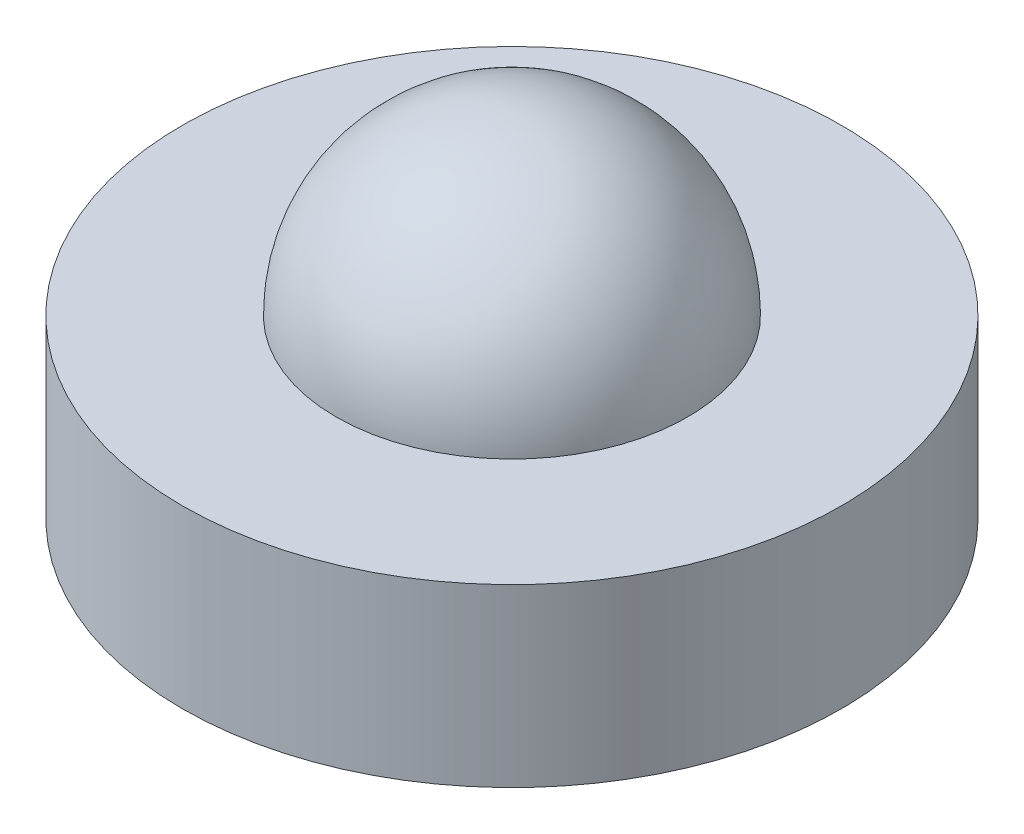
ISO-10303-21;
HEADER;
FILE_DESCRIPTION(('STEP AP214'),'2;1');
FILE_NAME('part.step','',(''),(''),'','','');
FILE_SCHEMA(('AUTOMOTIVE_DESIGN { 1 0 10303 214 1 1 1 1 }'));
ENDSEC;
DATA;
#1=APPLICATION_CONTEXT('core data for automotive mechanical design processes');
#2=APPLICATION_PROTOCOL_DEFINITION('international standard','automotive_design',2000,#1);
#3=PRODUCT_CONTEXT('',#1,'mechanical');
#4=PRODUCT('Part','Part','',(#3));
#5=PRODUCT_RELATED_PRODUCT_CATEGORY('part','',(#4));
#6=PRODUCT_DEFINITION_FORMATION('','',#4);
#7=PRODUCT_DEFINITION_CONTEXT('part definition',#1,'design');
#8=PRODUCT_DEFINITION('design','',#6,#7);
#9=PRODUCT_DEFINITION_SHAPE('','',#8);
#10=(LENGTH_UNIT() NAMED_UNIT(*) SI_UNIT(.MILLI.,.METRE.));
#11=(NAMED_UNIT(*) PLANE_ANGLE_UNIT() SI_UNIT($,.RADIAN.));
#12=(NAMED_UNIT(*) SI_UNIT($,.STERADIAN.) SOLID_ANGLE_UNIT());
#13=UNCERTAINTY_MEASURE_WITH_UNIT(LENGTH_MEASURE(1.E-05),#10,'distance_accuracy_value','');
#14=(GEOMETRIC_REPRESENTATION_CONTEXT(3) GLOBAL_UNCERTAINTY_ASSIGNED_CONTEXT((#13)) GLOBAL_UNIT_ASSIGNED_CONTEXT((#10,
#11,#12)) REPRESENTATION_CONTEXT('',''));
#15=CARTESIAN_POINT('',(0.,0.,0.));
#16=DIRECTION('',(0.,0.,1.));
#17=DIRECTION('',(1.,0.,0.));
#18=AXIS2_PLACEMENT_3D('',#15,#16,#17);
#19=CARTESIAN_POINT('',(0.,2.,0.));
#20=DIRECTION('',(-1.,0.,0.));
#21=DIRECTION('',(0.,0.,-1.));
#22=AXIS2_PLACEMENT_3D('',#19,#20,#21);
#23=SPHERICAL_SURFACE('',#22,2.);
#24=CARTESIAN_POINT('',(0.,2.,0.));
#25=DIRECTION('',(0.,1.,0.));
#26=DIRECTION('',(0.,0.,1.));
#27=AXIS2_PLACEMENT_3D('',#24,#25,#26);
#28=SPHERICAL_SURFACE('',#27,2.);
#29=CARTESIAN_POINT('',(0.,2.,0.));
#30=DIRECTION('',(0.,1.,0.));
#31=DIRECTION('',(0.,0.,1.));
#32=AXIS2_PLACEMENT_3D('',#29,#30,#31);
#33=CIRCLE('',#32,2.);
#34=CARTESIAN_POINT('',(0.,2.,2.));
#35=VERTEX_POINT('',#34);
#36=EDGE_CURVE('E11',#35,#35,#33,.T.);
#37=ORIENTED_EDGE('',*,*,#36,.T.);
#38=EDGE_LOOP('',(#37));
#39=FACE_BOUND('',#38,.T.);
#40=ADVANCED_FACE('F47',(#39),#28,.T.);
#41=CARTESIAN_POINT('',(-2.,2.,-3.75));
#42=DIRECTION('',(0.,1.,0.));
#43=DIRECTION('',(0.,0.,1.));
#44=AXIS2_PLACEMENT_3D('',#41,#42,#43);
#45=PLANE('',#44);
#46=ORIENTED_EDGE('',*,*,#36,.F.);
#47=EDGE_LOOP('',(#46));
#48=FACE_BOUND('',#47,.T.);
#49=ADVANCED_FACE('F55',(#48),#45,.F.);
#50=CLOSED_SHELL('',(#40,#49));
#51=MANIFOLD_SOLID_BREP('B2',#50);
#52=CARTESIAN_POINT('',(0.,2.,0.));
#53=DIRECTION('',(0.,-1.,0.));
#54=DIRECTION('',(0.,0.,-1.));
#55=AXIS2_PLACEMENT_3D('',#52,#53,#54);
#56=CYLINDRICAL_SURFACE('',#55,3.75);
#57=CARTESIAN_POINT('',(0.,2.,0.));
#58=DIRECTION('',(0.,1.,0.));
#59=DIRECTION('',(0.,0.,1.));
#60=AXIS2_PLACEMENT_3D('',#57,#58,#59);
#61=CIRCLE('',#60,3.75);
#62=CARTESIAN_POINT('',(0.,2.,3.75));
#63=VERTEX_POINT('',#62);
#64=EDGE_CURVE('E46',#63,#63,#61,.T.);
#65=ORIENTED_EDGE('',*,*,#64,.F.);
#66=EDGE_LOOP('',(#65));
#67=FACE_BOUND('',#66,.T.);
#68=CARTESIAN_POINT('',(0.,0.,0.));
#69=DIRECTION('',(0.,1.,0.));
#70=DIRECTION('',(0.,0.,1.));
#71=AXIS2_PLACEMENT_3D('',#68,#69,#70);
#72=CIRCLE('',#71,3.75);
#73=CARTESIAN_POINT('',(0.,0.,3.75));
#74=VERTEX_POINT('',#73);
#75=EDGE_CURVE('E76',#74,#74,#72,.T.);
#76=ORIENTED_EDGE('',*,*,#75,.T.);
#77=EDGE_LOOP('',(#76));
#78=FACE_BOUND('',#77,.T.);
#79=ADVANCED_FACE('F73',(#67,#78),#56,.T.);
#80=CARTESIAN_POINT('',(0.,2.,0.));
#81=DIRECTION('',(0.,1.,0.));
#82=DIRECTION('',(0.,0.,1.));
#83=AXIS2_PLACEMENT_3D('',#80,#81,#82);
#84=PLANE('',#83);
#85=ORIENTED_EDGE('',*,*,#64,.T.);
#86=EDGE_LOOP('',(#85));
#87=FACE_BOUND('',#86,.T.);
#88=ADVANCED_FACE('F90',(#87),#84,.T.);
#89=CARTESIAN_POINT('',(0.,0.,0.));
#90=DIRECTION('',(0.,1.,0.));
#91=DIRECTION('',(0.,0.,1.));
#92=AXIS2_PLACEMENT_3D('',#89,#90,#91);
#93=PLANE('',#92);
#94=ORIENTED_EDGE('',*,*,#75,.F.);
#95=EDGE_LOOP('',(#94));
#96=FACE_BOUND('',#95,.T.);
#97=ADVANCED_FACE('F88',(#96),#93,.F.);
#98=CLOSED_SHELL('',(#79,#88,#97));
#99=MANIFOLD_SOLID_BREP('B6',#98);
#100=ADVANCED_BREP_SHAPE_REPRESENTATION('',(#18,#51,#99),#14);
#101=SHAPE_DEFINITION_REPRESENTATION(#9,#100);
ENDSEC;
END-ISO-10303-21;
